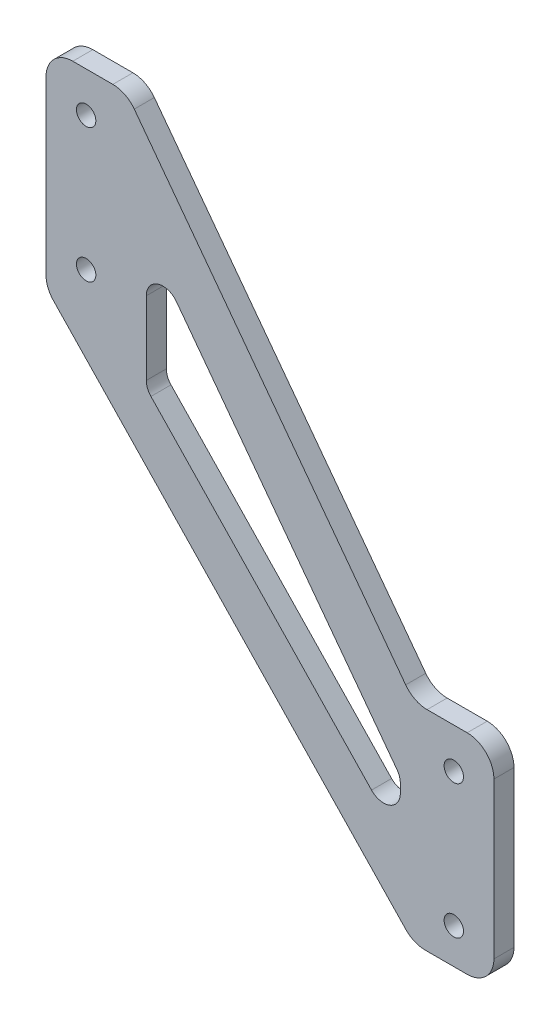
ISO-10303-21;
HEADER;
FILE_DESCRIPTION(('STEP AP214'),'2;1');
FILE_NAME('part.step','',(''),(''),'','','');
FILE_SCHEMA(('AUTOMOTIVE_DESIGN { 1 0 10303 214 1 1 1 1 }'));
ENDSEC;
DATA;
#1=APPLICATION_CONTEXT('core data for automotive mechanical design processes');
#2=APPLICATION_PROTOCOL_DEFINITION('international standard','automotive_design',2000,#1);
#3=PRODUCT_CONTEXT('',#1,'mechanical');
#4=PRODUCT('Part','Part','',(#3));
#5=PRODUCT_RELATED_PRODUCT_CATEGORY('part','',(#4));
#6=PRODUCT_DEFINITION_FORMATION('','',#4);
#7=PRODUCT_DEFINITION_CONTEXT('part definition',#1,'design');
#8=PRODUCT_DEFINITION('design','',#6,#7);
#9=PRODUCT_DEFINITION_SHAPE('','',#8);
#10=(LENGTH_UNIT() NAMED_UNIT(*) SI_UNIT(.MILLI.,.METRE.));
#11=(NAMED_UNIT(*) PLANE_ANGLE_UNIT() SI_UNIT($,.RADIAN.));
#12=(NAMED_UNIT(*) SI_UNIT($,.STERADIAN.) SOLID_ANGLE_UNIT());
#13=UNCERTAINTY_MEASURE_WITH_UNIT(LENGTH_MEASURE(1.E-05),#10,'distance_accuracy_value','');
#14=(GEOMETRIC_REPRESENTATION_CONTEXT(3) GLOBAL_UNCERTAINTY_ASSIGNED_CONTEXT((#13)) GLOBAL_UNIT_ASSIGNED_CONTEXT((#10,
#11,#12)) REPRESENTATION_CONTEXT('',''));
#15=CARTESIAN_POINT('',(0.,0.,0.));
#16=DIRECTION('',(0.,0.,1.));
#17=DIRECTION('',(1.,0.,0.));
#18=AXIS2_PLACEMENT_3D('',#15,#16,#17);
#19=CARTESIAN_POINT('',(0.,0.,3.));
#20=DIRECTION('',(0.,0.,1.));
#21=DIRECTION('',(1.,0.,0.));
#22=AXIS2_PLACEMENT_3D('',#19,#20,#21);
#23=PLANE('',#22);
#24=DIRECTION('',(-0.598885213021195,0.80083487787718,0.));
#25=VECTOR('',#24,1.);
#26=CARTESIAN_POINT('',(-8.,-4.68373388611148,3.));
#27=LINE('',#26,#25);
#28=CARTESIAN_POINT('',(-8.49791280530705,-4.01792025110787,3.));
#29=VERTEX_POINT('',#28);
#30=CARTESIAN_POINT('',(-41.4979128053071,40.1099867256363,3.));
#31=VERTEX_POINT('',#30);
#32=EDGE_CURVE('E346',#29,#31,#27,.T.);
#33=ORIENTED_EDGE('',*,*,#32,.F.);
#34=CARTESIAN_POINT('',(-10.5,-5.51513328366086,3.));
#35=DIRECTION('',(0.,0.,1.));
#36=DIRECTION('',(1.,0.,0.));
#37=AXIS2_PLACEMENT_3D('',#34,#35,#36);
#38=CIRCLE('',#37,2.5);
#39=CARTESIAN_POINT('',(-8.,-5.51513328366086,3.));
#40=VERTEX_POINT('',#39);
#41=EDGE_CURVE('E327',#29,#40,#38,.F.);
#42=ORIENTED_EDGE('',*,*,#41,.T.);
#43=DIRECTION('',(0.,1.,0.));
#44=VECTOR('',#43,1.);
#45=CARTESIAN_POINT('',(-8.,-13.0830754966218,3.));
#46=LINE('',#45,#44);
#47=CARTESIAN_POINT('',(-8.,-6.85265948234008,3.));
#48=VERTEX_POINT('',#47);
#49=EDGE_CURVE('E367',#48,#40,#46,.T.);
#50=ORIENTED_EDGE('',*,*,#49,.F.);
#51=CARTESIAN_POINT('',(-10.5,-6.85265948234008,3.));
#52=DIRECTION('',(0.,0.,1.));
#53=DIRECTION('',(1.,0.,0.));
#54=AXIS2_PLACEMENT_3D('',#51,#52,#53);
#55=CIRCLE('',#54,2.5);
#56=CARTESIAN_POINT('',(-12.3066046428692,-8.58071609725848,3.));
#57=VERTEX_POINT('',#56);
#58=EDGE_CURVE('E319',#48,#57,#55,.F.);
#59=ORIENTED_EDGE('',*,*,#58,.T.);
#60=DIRECTION('',(0.691222645967364,-0.722641857147699,0.));
#61=VECTOR('',#60,1.);
#62=CARTESIAN_POINT('',(-46.,26.644197230651,3.));
#63=LINE('',#62,#61);
#64=CARTESIAN_POINT('',(-45.3066046428693,25.9192839027415,3.));
#65=VERTEX_POINT('',#64);
#66=EDGE_CURVE('E337',#65,#57,#63,.T.);
#67=ORIENTED_EDGE('',*,*,#66,.F.);
#68=CARTESIAN_POINT('',(-43.5,27.6473405176599,3.));
#69=DIRECTION('',(0.,0.,1.));
#70=DIRECTION('',(1.,0.,0.));
#71=AXIS2_PLACEMENT_3D('',#68,#69,#70);
#72=CIRCLE('',#71,2.5);
#73=CARTESIAN_POINT('',(-46.,27.6473405176599,3.));
#74=VERTEX_POINT('',#73);
#75=EDGE_CURVE('E52',#65,#74,#72,.F.);
#76=ORIENTED_EDGE('',*,*,#75,.T.);
#77=DIRECTION('',(0.,-1.,0.));
#78=VECTOR('',#77,1.);
#79=CARTESIAN_POINT('',(-46.,46.1302196022606,3.));
#80=LINE('',#79,#78);
#81=CARTESIAN_POINT('',(-46.,38.6127736930833,3.));
#82=VERTEX_POINT('',#81);
#83=EDGE_CURVE('E335',#82,#74,#80,.T.);
#84=ORIENTED_EDGE('',*,*,#83,.F.);
#85=CARTESIAN_POINT('',(-43.5,38.6127736930833,3.));
#86=DIRECTION('',(0.,0.,1.));
#87=DIRECTION('',(1.,0.,0.));
#88=AXIS2_PLACEMENT_3D('',#85,#86,#87);
#89=CIRCLE('',#88,2.5);
#90=EDGE_CURVE('E323',#82,#31,#89,.F.);
#91=ORIENTED_EDGE('',*,*,#90,.T.);
#92=EDGE_LOOP('',(#33,#42,#50,#59,#67,#76,#84,#91));
#93=FACE_BOUND('',#92,.T.);
#94=CARTESIAN_POINT('',(-55.,37.5,3.));
#95=DIRECTION('',(0.,0.,1.));
#96=DIRECTION('',(1.,0.,0.));
#97=AXIS2_PLACEMENT_3D('',#94,#95,#96);
#98=CIRCLE('',#97,1.45);
#99=CARTESIAN_POINT('',(-53.55,37.5,3.));
#100=VERTEX_POINT('',#99);
#101=EDGE_CURVE('E376',#100,#100,#98,.T.);
#102=ORIENTED_EDGE('',*,*,#101,.F.);
#103=EDGE_LOOP('',(#102));
#104=FACE_BOUND('',#103,.T.);
#105=CARTESIAN_POINT('',(0.,0.,3.));
#106=DIRECTION('',(0.,0.,1.));
#107=DIRECTION('',(1.,0.,0.));
#108=AXIS2_PLACEMENT_3D('',#105,#106,#107);
#109=CIRCLE('',#108,1.45);
#110=CARTESIAN_POINT('',(1.45,0.,3.));
#111=VERTEX_POINT('',#110);
#112=EDGE_CURVE('E223',#111,#111,#109,.T.);
#113=ORIENTED_EDGE('',*,*,#112,.F.);
#114=EDGE_LOOP('',(#113));
#115=FACE_BOUND('',#114,.T.);
#116=DIRECTION('',(0.,1.,0.));
#117=VECTOR('',#116,1.);
#118=CARTESIAN_POINT('',(6.,-25.3009676093379,3.));
#119=LINE('',#118,#117);
#120=CARTESIAN_POINT('',(6.,-21.3009676093379,3.));
#121=VERTEX_POINT('',#120);
#122=CARTESIAN_POINT('',(6.,2.,3.));
#123=VERTEX_POINT('',#122);
#124=EDGE_CURVE('E401',#121,#123,#119,.T.);
#125=ORIENTED_EDGE('',*,*,#124,.T.);
#126=CARTESIAN_POINT('',(2.,2.,3.));
#127=DIRECTION('',(0.,0.,1.));
#128=DIRECTION('',(1.,0.,0.));
#129=AXIS2_PLACEMENT_3D('',#126,#127,#128);
#130=CIRCLE('',#129,4.);
#131=CARTESIAN_POINT('',(2.,6.,3.));
#132=VERTEX_POINT('',#131);
#133=EDGE_CURVE('E278',#123,#132,#130,.T.);
#134=ORIENTED_EDGE('',*,*,#133,.T.);
#135=DIRECTION('',(-1.,0.,0.));
#136=VECTOR('',#135,1.);
#137=CARTESIAN_POINT('',(6.,6.,3.));
#138=LINE('',#137,#136);
#139=CARTESIAN_POINT('',(-3.99651689475831,6.,3.));
#140=VERTEX_POINT('',#139);
#141=EDGE_CURVE('E232',#132,#140,#138,.T.);
#142=ORIENTED_EDGE('',*,*,#141,.T.);
#143=CARTESIAN_POINT('',(-3.99651689475831,10.,3.));
#144=DIRECTION('',(0.,0.,1.));
#145=DIRECTION('',(1.,0.,0.));
#146=AXIS2_PLACEMENT_3D('',#143,#144,#145);
#147=CIRCLE('',#146,4.);
#148=CARTESIAN_POINT('',(-7.19985640626703,7.60445914791522,3.));
#149=VERTEX_POINT('',#148);
#150=EDGE_CURVE('E204',#140,#149,#147,.F.);
#151=ORIENTED_EDGE('',*,*,#150,.T.);
#152=DIRECTION('',(-0.598885213021195,0.80083487787718,0.));
#153=VECTOR('',#152,1.);
#154=CARTESIAN_POINT('',(-6.,6.,3.));
#155=LINE('',#154,#153);
#156=CARTESIAN_POINT('',(-47.800143593733,61.8955408520847,3.));
#157=VERTEX_POINT('',#156);
#158=EDGE_CURVE('E214',#149,#157,#155,.T.);
#159=ORIENTED_EDGE('',*,*,#158,.T.);
#160=CARTESIAN_POINT('',(-51.0034831052417,59.5,3.));
#161=DIRECTION('',(0.,0.,1.));
#162=DIRECTION('',(1.,0.,0.));
#163=AXIS2_PLACEMENT_3D('',#160,#161,#162);
#164=CIRCLE('',#163,4.);
#165=CARTESIAN_POINT('',(-51.0034831052417,63.5,3.));
#166=VERTEX_POINT('',#165);
#167=EDGE_CURVE('E268',#157,#166,#164,.T.);
#168=ORIENTED_EDGE('',*,*,#167,.T.);
#169=DIRECTION('',(-1.,0.,0.));
#170=VECTOR('',#169,1.);
#171=CARTESIAN_POINT('',(-49.,63.5,3.));
#172=LINE('',#171,#170);
#173=CARTESIAN_POINT('',(-57.,63.5,3.));
#174=VERTEX_POINT('',#173);
#175=EDGE_CURVE('E390',#166,#174,#172,.T.);
#176=ORIENTED_EDGE('',*,*,#175,.T.);
#177=CARTESIAN_POINT('',(-57.,59.5,3.));
#178=DIRECTION('',(0.,0.,1.));
#179=DIRECTION('',(1.,0.,0.));
#180=AXIS2_PLACEMENT_3D('',#177,#178,#179);
#181=CIRCLE('',#180,4.);
#182=CARTESIAN_POINT('',(-61.,59.5,3.));
#183=VERTEX_POINT('',#182);
#184=EDGE_CURVE('E270',#174,#183,#181,.T.);
#185=ORIENTED_EDGE('',*,*,#184,.T.);
#186=DIRECTION('',(0.,-1.,0.));
#187=VECTOR('',#186,1.);
#188=CARTESIAN_POINT('',(-61.,63.5,3.));
#189=LINE('',#188,#187);
#190=CARTESIAN_POINT('',(-61.,33.8040616498765,3.));
#191=VERTEX_POINT('',#190);
#192=EDGE_CURVE('E393',#183,#191,#189,.T.);
#193=ORIENTED_EDGE('',*,*,#192,.T.);
#194=CARTESIAN_POINT('',(-57.,33.8040616498765,3.));
#195=DIRECTION('',(0.,0.,1.));
#196=DIRECTION('',(1.,0.,0.));
#197=AXIS2_PLACEMENT_3D('',#194,#195,#196);
#198=CIRCLE('',#197,4.);
#199=CARTESIAN_POINT('',(-59.8905674285908,31.0391710660071,3.));
#200=VERTEX_POINT('',#199);
#201=EDGE_CURVE('E272',#191,#200,#198,.T.);
#202=ORIENTED_EDGE('',*,*,#201,.T.);
#203=DIRECTION('',(0.691222645967364,-0.722641857147699,0.));
#204=VECTOR('',#203,1.);
#205=CARTESIAN_POINT('',(-61.,32.1990323906622,3.));
#206=LINE('',#205,#204);
#207=CARTESIAN_POINT('',(-7.18140900673357,-24.0658581932073,3.));
#208=VERTEX_POINT('',#207);
#209=EDGE_CURVE('E396',#200,#208,#206,.T.);
#210=ORIENTED_EDGE('',*,*,#209,.T.);
#211=CARTESIAN_POINT('',(-4.29084157814277,-21.3009676093379,3.));
#212=DIRECTION('',(0.,0.,1.));
#213=DIRECTION('',(1.,0.,0.));
#214=AXIS2_PLACEMENT_3D('',#211,#212,#213);
#215=CIRCLE('',#214,4.);
#216=CARTESIAN_POINT('',(-4.29084157814277,-25.3009676093379,3.));
#217=VERTEX_POINT('',#216);
#218=EDGE_CURVE('E274',#208,#217,#215,.T.);
#219=ORIENTED_EDGE('',*,*,#218,.T.);
#220=DIRECTION('',(1.,0.,0.));
#221=VECTOR('',#220,1.);
#222=CARTESIAN_POINT('',(-6.,-25.3009676093379,3.));
#223=LINE('',#222,#221);
#224=CARTESIAN_POINT('',(2.,-25.3009676093379,3.));
#225=VERTEX_POINT('',#224);
#226=EDGE_CURVE('E399',#217,#225,#223,.T.);
#227=ORIENTED_EDGE('',*,*,#226,.T.);
#228=CARTESIAN_POINT('',(2.,-21.3009676093379,3.));
#229=DIRECTION('',(0.,0.,1.));
#230=DIRECTION('',(1.,0.,0.));
#231=AXIS2_PLACEMENT_3D('',#228,#229,#230);
#232=CIRCLE('',#231,4.);
#233=EDGE_CURVE('E276',#225,#121,#232,.T.);
#234=ORIENTED_EDGE('',*,*,#233,.T.);
#235=EDGE_LOOP('',(#125,#134,#142,#151,#159,#168,#176,#185,#193,#202,#210,#219,#227,#234));
#236=FACE_BOUND('',#235,.T.);
#237=CARTESIAN_POINT('',(0.,-20.,3.));
#238=DIRECTION('',(0.,0.,1.));
#239=DIRECTION('',(1.,0.,0.));
#240=AXIS2_PLACEMENT_3D('',#237,#238,#239);
#241=CIRCLE('',#240,1.45);
#242=CARTESIAN_POINT('',(1.45,-20.,3.));
#243=VERTEX_POINT('',#242);
#244=EDGE_CURVE('E382',#243,#243,#241,.T.);
#245=ORIENTED_EDGE('',*,*,#244,.F.);
#246=EDGE_LOOP('',(#245));
#247=FACE_BOUND('',#246,.T.);
#248=CARTESIAN_POINT('',(-55.,57.5,3.));
#249=DIRECTION('',(0.,0.,1.));
#250=DIRECTION('',(1.,0.,0.));
#251=AXIS2_PLACEMENT_3D('',#248,#249,#250);
#252=CIRCLE('',#251,1.45);
#253=CARTESIAN_POINT('',(-53.55,57.5,3.));
#254=VERTEX_POINT('',#253);
#255=EDGE_CURVE('E370',#254,#254,#252,.T.);
#256=ORIENTED_EDGE('',*,*,#255,.F.);
#257=EDGE_LOOP('',(#256));
#258=FACE_BOUND('',#257,.T.);
#259=ADVANCED_FACE('F44',(#93,#104,#115,#236,#247,#258),#23,.T.);
#260=CARTESIAN_POINT('',(0.,0.,0.));
#261=DIRECTION('',(0.,0.,1.));
#262=DIRECTION('',(1.,0.,0.));
#263=AXIS2_PLACEMENT_3D('',#260,#261,#262);
#264=PLANE('',#263);
#265=DIRECTION('',(0.691222645967364,-0.722641857147699,0.));
#266=VECTOR('',#265,1.);
#267=CARTESIAN_POINT('',(-46.,26.644197230651,0.));
#268=LINE('',#267,#266);
#269=CARTESIAN_POINT('',(-45.3066046428693,25.9192839027415,0.));
#270=VERTEX_POINT('',#269);
#271=CARTESIAN_POINT('',(-12.3066046428692,-8.58071609725848,0.));
#272=VERTEX_POINT('',#271);
#273=EDGE_CURVE('E351',#270,#272,#268,.T.);
#274=ORIENTED_EDGE('',*,*,#273,.T.);
#275=CARTESIAN_POINT('',(-10.5,-6.85265948234008,0.));
#276=DIRECTION('',(0.,0.,1.));
#277=DIRECTION('',(1.,0.,0.));
#278=AXIS2_PLACEMENT_3D('',#275,#276,#277);
#279=CIRCLE('',#278,2.5);
#280=CARTESIAN_POINT('',(-8.,-6.85265948234008,0.));
#281=VERTEX_POINT('',#280);
#282=EDGE_CURVE('E321',#272,#281,#279,.T.);
#283=ORIENTED_EDGE('',*,*,#282,.T.);
#284=DIRECTION('',(0.,1.,0.));
#285=VECTOR('',#284,1.);
#286=CARTESIAN_POINT('',(-8.,-13.0830754966218,0.));
#287=LINE('',#286,#285);
#288=CARTESIAN_POINT('',(-8.,-5.51513328366086,0.));
#289=VERTEX_POINT('',#288);
#290=EDGE_CURVE('E357',#281,#289,#287,.T.);
#291=ORIENTED_EDGE('',*,*,#290,.T.);
#292=CARTESIAN_POINT('',(-10.5,-5.51513328366086,0.));
#293=DIRECTION('',(0.,0.,1.));
#294=DIRECTION('',(1.,0.,0.));
#295=AXIS2_PLACEMENT_3D('',#292,#293,#294);
#296=CIRCLE('',#295,2.5);
#297=CARTESIAN_POINT('',(-8.49791280530705,-4.01792025110787,0.));
#298=VERTEX_POINT('',#297);
#299=EDGE_CURVE('E66',#289,#298,#296,.T.);
#300=ORIENTED_EDGE('',*,*,#299,.T.);
#301=DIRECTION('',(-0.598885213021195,0.80083487787718,0.));
#302=VECTOR('',#301,1.);
#303=CARTESIAN_POINT('',(-8.,-4.68373388611148,0.));
#304=LINE('',#303,#302);
#305=CARTESIAN_POINT('',(-41.4979128053071,40.1099867256363,0.));
#306=VERTEX_POINT('',#305);
#307=EDGE_CURVE('E361',#298,#306,#304,.T.);
#308=ORIENTED_EDGE('',*,*,#307,.T.);
#309=CARTESIAN_POINT('',(-43.5,38.6127736930833,0.));
#310=DIRECTION('',(0.,0.,1.));
#311=DIRECTION('',(1.,0.,0.));
#312=AXIS2_PLACEMENT_3D('',#309,#310,#311);
#313=CIRCLE('',#312,2.5);
#314=CARTESIAN_POINT('',(-46.,38.6127736930833,0.));
#315=VERTEX_POINT('',#314);
#316=EDGE_CURVE('E325',#306,#315,#313,.T.);
#317=ORIENTED_EDGE('',*,*,#316,.T.);
#318=DIRECTION('',(0.,-1.,0.));
#319=VECTOR('',#318,1.);
#320=CARTESIAN_POINT('',(-46.,46.1302196022606,0.));
#321=LINE('',#320,#319);
#322=CARTESIAN_POINT('',(-46.,27.6473405176599,0.));
#323=VERTEX_POINT('',#322);
#324=EDGE_CURVE('E353',#315,#323,#321,.T.);
#325=ORIENTED_EDGE('',*,*,#324,.T.);
#326=CARTESIAN_POINT('',(-43.5,27.6473405176599,0.));
#327=DIRECTION('',(0.,0.,1.));
#328=DIRECTION('',(1.,0.,0.));
#329=AXIS2_PLACEMENT_3D('',#326,#327,#328);
#330=CIRCLE('',#329,2.5);
#331=EDGE_CURVE('E11',#323,#270,#330,.T.);
#332=ORIENTED_EDGE('',*,*,#331,.T.);
#333=EDGE_LOOP('',(#274,#283,#291,#300,#308,#317,#325,#332));
#334=FACE_BOUND('',#333,.T.);
#335=DIRECTION('',(-1.,0.,0.));
#336=VECTOR('',#335,1.);
#337=CARTESIAN_POINT('',(6.,6.,0.));
#338=LINE('',#337,#336);
#339=CARTESIAN_POINT('',(2.,6.,0.));
#340=VERTEX_POINT('',#339);
#341=CARTESIAN_POINT('',(-3.99651689475831,6.,0.));
#342=VERTEX_POINT('',#341);
#343=EDGE_CURVE('E246',#340,#342,#338,.T.);
#344=ORIENTED_EDGE('',*,*,#343,.F.);
#345=CARTESIAN_POINT('',(2.,2.,0.));
#346=DIRECTION('',(0.,0.,1.));
#347=DIRECTION('',(1.,0.,0.));
#348=AXIS2_PLACEMENT_3D('',#345,#346,#347);
#349=CIRCLE('',#348,4.);
#350=CARTESIAN_POINT('',(6.,2.,0.));
#351=VERTEX_POINT('',#350);
#352=EDGE_CURVE('E261',#340,#351,#349,.F.);
#353=ORIENTED_EDGE('',*,*,#352,.T.);
#354=DIRECTION('',(0.,1.,0.));
#355=VECTOR('',#354,1.);
#356=CARTESIAN_POINT('',(6.,-25.3009676093379,0.));
#357=LINE('',#356,#355);
#358=CARTESIAN_POINT('',(6.,-21.3009676093379,0.));
#359=VERTEX_POINT('',#358);
#360=EDGE_CURVE('E243',#359,#351,#357,.T.);
#361=ORIENTED_EDGE('',*,*,#360,.F.);
#362=CARTESIAN_POINT('',(2.,-21.3009676093379,0.));
#363=DIRECTION('',(0.,0.,1.));
#364=DIRECTION('',(1.,0.,0.));
#365=AXIS2_PLACEMENT_3D('',#362,#363,#364);
#366=CIRCLE('',#365,4.);
#367=CARTESIAN_POINT('',(2.,-25.3009676093379,0.));
#368=VERTEX_POINT('',#367);
#369=EDGE_CURVE('E259',#359,#368,#366,.F.);
#370=ORIENTED_EDGE('',*,*,#369,.T.);
#371=DIRECTION('',(1.,0.,0.));
#372=VECTOR('',#371,1.);
#373=CARTESIAN_POINT('',(-6.,-25.3009676093379,0.));
#374=LINE('',#373,#372);
#375=CARTESIAN_POINT('',(-4.29084157814277,-25.3009676093379,0.));
#376=VERTEX_POINT('',#375);
#377=EDGE_CURVE('E240',#376,#368,#374,.T.);
#378=ORIENTED_EDGE('',*,*,#377,.F.);
#379=CARTESIAN_POINT('',(-4.29084157814277,-21.3009676093379,0.));
#380=DIRECTION('',(0.,0.,1.));
#381=DIRECTION('',(1.,0.,0.));
#382=AXIS2_PLACEMENT_3D('',#379,#380,#381);
#383=CIRCLE('',#382,4.);
#384=CARTESIAN_POINT('',(-7.18140900673357,-24.0658581932073,0.));
#385=VERTEX_POINT('',#384);
#386=EDGE_CURVE('E257',#376,#385,#383,.F.);
#387=ORIENTED_EDGE('',*,*,#386,.T.);
#388=DIRECTION('',(0.691222645967364,-0.722641857147699,0.));
#389=VECTOR('',#388,1.);
#390=CARTESIAN_POINT('',(-61.,32.1990323906622,0.));
#391=LINE('',#390,#389);
#392=CARTESIAN_POINT('',(-59.8905674285908,31.0391710660071,0.));
#393=VERTEX_POINT('',#392);
#394=EDGE_CURVE('E237',#393,#385,#391,.T.);
#395=ORIENTED_EDGE('',*,*,#394,.F.);
#396=CARTESIAN_POINT('',(-57.,33.8040616498765,0.));
#397=DIRECTION('',(0.,0.,1.));
#398=DIRECTION('',(1.,0.,0.));
#399=AXIS2_PLACEMENT_3D('',#396,#397,#398);
#400=CIRCLE('',#399,4.);
#401=CARTESIAN_POINT('',(-61.,33.8040616498765,0.));
#402=VERTEX_POINT('',#401);
#403=EDGE_CURVE('E255',#393,#402,#400,.F.);
#404=ORIENTED_EDGE('',*,*,#403,.T.);
#405=DIRECTION('',(0.,-1.,0.));
#406=VECTOR('',#405,1.);
#407=CARTESIAN_POINT('',(-61.,63.5,0.));
#408=LINE('',#407,#406);
#409=CARTESIAN_POINT('',(-61.,59.5,0.));
#410=VERTEX_POINT('',#409);
#411=EDGE_CURVE('E226',#410,#402,#408,.T.);
#412=ORIENTED_EDGE('',*,*,#411,.F.);
#413=CARTESIAN_POINT('',(-57.,59.5,0.));
#414=DIRECTION('',(0.,0.,1.));
#415=DIRECTION('',(1.,0.,0.));
#416=AXIS2_PLACEMENT_3D('',#413,#414,#415);
#417=CIRCLE('',#416,4.);
#418=CARTESIAN_POINT('',(-57.,63.5,0.));
#419=VERTEX_POINT('',#418);
#420=EDGE_CURVE('E253',#410,#419,#417,.F.);
#421=ORIENTED_EDGE('',*,*,#420,.T.);
#422=DIRECTION('',(-1.,0.,0.));
#423=VECTOR('',#422,1.);
#424=CARTESIAN_POINT('',(-49.,63.5,0.));
#425=LINE('',#424,#423);
#426=CARTESIAN_POINT('',(-51.0034831052417,63.5,0.));
#427=VERTEX_POINT('',#426);
#428=EDGE_CURVE('E222',#427,#419,#425,.T.);
#429=ORIENTED_EDGE('',*,*,#428,.F.);
#430=CARTESIAN_POINT('',(-51.0034831052417,59.5,0.));
#431=DIRECTION('',(0.,0.,1.));
#432=DIRECTION('',(1.,0.,0.));
#433=AXIS2_PLACEMENT_3D('',#430,#431,#432);
#434=CIRCLE('',#433,4.);
#435=CARTESIAN_POINT('',(-47.800143593733,61.8955408520847,0.));
#436=VERTEX_POINT('',#435);
#437=EDGE_CURVE('E221',#427,#436,#434,.F.);
#438=ORIENTED_EDGE('',*,*,#437,.T.);
#439=DIRECTION('',(-0.598885213021195,0.80083487787718,0.));
#440=VECTOR('',#439,1.);
#441=CARTESIAN_POINT('',(-6.,6.,0.));
#442=LINE('',#441,#440);
#443=CARTESIAN_POINT('',(-7.19985640626703,7.60445914791522,0.));
#444=VERTEX_POINT('',#443);
#445=EDGE_CURVE('E211',#444,#436,#442,.T.);
#446=ORIENTED_EDGE('',*,*,#445,.F.);
#447=CARTESIAN_POINT('',(-3.99651689475831,10.,0.));
#448=DIRECTION('',(0.,0.,1.));
#449=DIRECTION('',(1.,0.,0.));
#450=AXIS2_PLACEMENT_3D('',#447,#448,#449);
#451=CIRCLE('',#450,4.);
#452=EDGE_CURVE('E194',#444,#342,#451,.T.);
#453=ORIENTED_EDGE('',*,*,#452,.T.);
#454=EDGE_LOOP('',(#344,#353,#361,#370,#378,#387,#395,#404,#412,#421,#429,#438,#446,#453));
#455=FACE_BOUND('',#454,.T.);
#456=CARTESIAN_POINT('',(0.,0.,0.));
#457=DIRECTION('',(0.,0.,1.));
#458=DIRECTION('',(1.,0.,0.));
#459=AXIS2_PLACEMENT_3D('',#456,#457,#458);
#460=CIRCLE('',#459,1.45);
#461=CARTESIAN_POINT('',(1.45,0.,0.));
#462=VERTEX_POINT('',#461);
#463=EDGE_CURVE('E229',#462,#462,#460,.T.);
#464=ORIENTED_EDGE('',*,*,#463,.T.);
#465=EDGE_LOOP('',(#464));
#466=FACE_BOUND('',#465,.T.);
#467=CARTESIAN_POINT('',(0.,-20.,0.));
#468=DIRECTION('',(0.,0.,1.));
#469=DIRECTION('',(1.,0.,0.));
#470=AXIS2_PLACEMENT_3D('',#467,#468,#469);
#471=CIRCLE('',#470,1.45);
#472=CARTESIAN_POINT('',(1.45,-20.,0.));
#473=VERTEX_POINT('',#472);
#474=EDGE_CURVE('E379',#473,#473,#471,.T.);
#475=ORIENTED_EDGE('',*,*,#474,.T.);
#476=EDGE_LOOP('',(#475));
#477=FACE_BOUND('',#476,.T.);
#478=CARTESIAN_POINT('',(-55.,37.5,0.));
#479=DIRECTION('',(0.,0.,1.));
#480=DIRECTION('',(1.,0.,0.));
#481=AXIS2_PLACEMENT_3D('',#478,#479,#480);
#482=CIRCLE('',#481,1.45);
#483=CARTESIAN_POINT('',(-53.55,37.5,0.));
#484=VERTEX_POINT('',#483);
#485=EDGE_CURVE('E373',#484,#484,#482,.T.);
#486=ORIENTED_EDGE('',*,*,#485,.T.);
#487=EDGE_LOOP('',(#486));
#488=FACE_BOUND('',#487,.T.);
#489=CARTESIAN_POINT('',(-55.,57.5,0.));
#490=DIRECTION('',(0.,0.,1.));
#491=DIRECTION('',(1.,0.,0.));
#492=AXIS2_PLACEMENT_3D('',#489,#490,#491);
#493=CIRCLE('',#492,1.45);
#494=CARTESIAN_POINT('',(-53.55,57.5,0.));
#495=VERTEX_POINT('',#494);
#496=EDGE_CURVE('E359',#495,#495,#493,.T.);
#497=ORIENTED_EDGE('',*,*,#496,.T.);
#498=EDGE_LOOP('',(#497));
#499=FACE_BOUND('',#498,.T.);
#500=ADVANCED_FACE('F218',(#334,#455,#466,#477,#488,#499),#264,.F.);
#501=CARTESIAN_POINT('',(-6.,6.,3.));
#502=DIRECTION('',(-0.80083487787718,-0.598885213021196,0.));
#503=DIRECTION('',(0.598885213021196,-0.80083487787718,0.));
#504=AXIS2_PLACEMENT_3D('',#501,#502,#503);
#505=PLANE('',#504);
#506=ORIENTED_EDGE('',*,*,#158,.F.);
#507=DIRECTION('',(0.,0.,-1.));
#508=VECTOR('',#507,1.);
#509=CARTESIAN_POINT('',(-7.19985640626703,7.60445914791522,0.));
#510=LINE('',#509,#508);
#511=EDGE_CURVE('E198',#149,#444,#510,.T.);
#512=ORIENTED_EDGE('',*,*,#511,.T.);
#513=ORIENTED_EDGE('',*,*,#445,.T.);
#514=DIRECTION('',(0.,0.,-1.));
#515=VECTOR('',#514,1.);
#516=CARTESIAN_POINT('',(-47.800143593733,61.8955408520848,3.));
#517=LINE('',#516,#515);
#518=EDGE_CURVE('E216',#436,#157,#517,.F.);
#519=ORIENTED_EDGE('',*,*,#518,.T.);
#520=EDGE_LOOP('',(#506,#512,#513,#519));
#521=FACE_BOUND('',#520,.T.);
#522=ADVANCED_FACE('F210',(#521),#505,.F.);
#523=CARTESIAN_POINT('',(-49.,63.5,3.));
#524=DIRECTION('',(0.,-1.,0.));
#525=DIRECTION('',(0.,0.,-1.));
#526=AXIS2_PLACEMENT_3D('',#523,#524,#525);
#527=PLANE('',#526);
#528=ORIENTED_EDGE('',*,*,#428,.T.);
#529=DIRECTION('',(0.,0.,-1.));
#530=VECTOR('',#529,1.);
#531=CARTESIAN_POINT('',(-57.,63.5,3.));
#532=LINE('',#531,#530);
#533=EDGE_CURVE('E205',#419,#174,#532,.F.);
#534=ORIENTED_EDGE('',*,*,#533,.T.);
#535=ORIENTED_EDGE('',*,*,#175,.F.);
#536=DIRECTION('',(0.,0.,-1.));
#537=VECTOR('',#536,1.);
#538=CARTESIAN_POINT('',(-51.0034831052417,63.5,3.));
#539=LINE('',#538,#537);
#540=EDGE_CURVE('E295',#166,#427,#539,.T.);
#541=ORIENTED_EDGE('',*,*,#540,.T.);
#542=EDGE_LOOP('',(#528,#534,#535,#541));
#543=FACE_BOUND('',#542,.T.);
#544=ADVANCED_FACE('F451',(#543),#527,.F.);
#545=CARTESIAN_POINT('',(-61.,63.5,3.));
#546=DIRECTION('',(1.,0.,0.));
#547=DIRECTION('',(0.,1.,0.));
#548=AXIS2_PLACEMENT_3D('',#545,#546,#547);
#549=PLANE('',#548);
#550=ORIENTED_EDGE('',*,*,#411,.T.);
#551=DIRECTION('',(0.,0.,-1.));
#552=VECTOR('',#551,1.);
#553=CARTESIAN_POINT('',(-61.,33.8040616498765,3.));
#554=LINE('',#553,#552);
#555=EDGE_CURVE('E293',#402,#191,#554,.F.);
#556=ORIENTED_EDGE('',*,*,#555,.T.);
#557=ORIENTED_EDGE('',*,*,#192,.F.);
#558=DIRECTION('',(0.,0.,-1.));
#559=VECTOR('',#558,1.);
#560=CARTESIAN_POINT('',(-61.,59.5,3.));
#561=LINE('',#560,#559);
#562=EDGE_CURVE('E290',#183,#410,#561,.T.);
#563=ORIENTED_EDGE('',*,*,#562,.T.);
#564=EDGE_LOOP('',(#550,#556,#557,#563));
#565=FACE_BOUND('',#564,.T.);
#566=ADVANCED_FACE('F443',(#565),#549,.F.);
#567=CARTESIAN_POINT('',(-61.,32.1990323906622,3.));
#568=DIRECTION('',(0.722641857147699,0.691222645967364,0.));
#569=DIRECTION('',(-0.691222645967364,0.722641857147699,0.));
#570=AXIS2_PLACEMENT_3D('',#567,#568,#569);
#571=PLANE('',#570);
#572=ORIENTED_EDGE('',*,*,#394,.T.);
#573=DIRECTION('',(0.,0.,-1.));
#574=VECTOR('',#573,1.);
#575=CARTESIAN_POINT('',(-7.18140900673357,-24.0658581932073,3.));
#576=LINE('',#575,#574);
#577=EDGE_CURVE('E288',#385,#208,#576,.F.);
#578=ORIENTED_EDGE('',*,*,#577,.T.);
#579=ORIENTED_EDGE('',*,*,#209,.F.);
#580=DIRECTION('',(0.,0.,-1.));
#581=VECTOR('',#580,1.);
#582=CARTESIAN_POINT('',(-59.8905674285908,31.0391710660071,3.));
#583=LINE('',#582,#581);
#584=EDGE_CURVE('E285',#200,#393,#583,.T.);
#585=ORIENTED_EDGE('',*,*,#584,.T.);
#586=EDGE_LOOP('',(#572,#578,#579,#585));
#587=FACE_BOUND('',#586,.T.);
#588=ADVANCED_FACE('F434',(#587),#571,.F.);
#589=CARTESIAN_POINT('',(-6.,-25.3009676093379,3.));
#590=DIRECTION('',(0.,1.,0.));
#591=DIRECTION('',(0.,0.,1.));
#592=AXIS2_PLACEMENT_3D('',#589,#590,#591);
#593=PLANE('',#592);
#594=ORIENTED_EDGE('',*,*,#377,.T.);
#595=DIRECTION('',(0.,0.,-1.));
#596=VECTOR('',#595,1.);
#597=CARTESIAN_POINT('',(2.,-25.3009676093379,3.));
#598=LINE('',#597,#596);
#599=EDGE_CURVE('E283',#368,#225,#598,.F.);
#600=ORIENTED_EDGE('',*,*,#599,.T.);
#601=ORIENTED_EDGE('',*,*,#226,.F.);
#602=DIRECTION('',(0.,0.,-1.));
#603=VECTOR('',#602,1.);
#604=CARTESIAN_POINT('',(-4.29084157814277,-25.3009676093379,3.));
#605=LINE('',#604,#603);
#606=EDGE_CURVE('E280',#217,#376,#605,.T.);
#607=ORIENTED_EDGE('',*,*,#606,.T.);
#608=EDGE_LOOP('',(#594,#600,#601,#607));
#609=FACE_BOUND('',#608,.T.);
#610=ADVANCED_FACE('F425',(#609),#593,.F.);
#611=CARTESIAN_POINT('',(6.,-25.3009676093379,3.));
#612=DIRECTION('',(-1.,0.,0.));
#613=DIRECTION('',(0.,-1.,0.));
#614=AXIS2_PLACEMENT_3D('',#611,#612,#613);
#615=PLANE('',#614);
#616=ORIENTED_EDGE('',*,*,#360,.T.);
#617=DIRECTION('',(0.,0.,-1.));
#618=VECTOR('',#617,1.);
#619=CARTESIAN_POINT('',(6.,2.,3.));
#620=LINE('',#619,#618);
#621=EDGE_CURVE('E266',#351,#123,#620,.F.);
#622=ORIENTED_EDGE('',*,*,#621,.T.);
#623=ORIENTED_EDGE('',*,*,#124,.F.);
#624=DIRECTION('',(0.,0.,-1.));
#625=VECTOR('',#624,1.);
#626=CARTESIAN_POINT('',(6.,-21.3009676093379,3.));
#627=LINE('',#626,#625);
#628=EDGE_CURVE('E263',#121,#359,#627,.T.);
#629=ORIENTED_EDGE('',*,*,#628,.T.);
#630=EDGE_LOOP('',(#616,#622,#623,#629));
#631=FACE_BOUND('',#630,.T.);
#632=ADVANCED_FACE('F417',(#631),#615,.F.);
#633=CARTESIAN_POINT('',(6.,6.,3.));
#634=DIRECTION('',(0.,-1.,0.));
#635=DIRECTION('',(1.,0.,0.));
#636=AXIS2_PLACEMENT_3D('',#633,#634,#635);
#637=PLANE('',#636);
#638=ORIENTED_EDGE('',*,*,#343,.T.);
#639=DIRECTION('',(0.,0.,-1.));
#640=VECTOR('',#639,1.);
#641=CARTESIAN_POINT('',(-3.99651689475831,6.,3.));
#642=LINE('',#641,#640);
#643=EDGE_CURVE('E199',#342,#140,#642,.F.);
#644=ORIENTED_EDGE('',*,*,#643,.T.);
#645=ORIENTED_EDGE('',*,*,#141,.F.);
#646=DIRECTION('',(0.,0.,-1.));
#647=VECTOR('',#646,1.);
#648=CARTESIAN_POINT('',(2.,6.,3.));
#649=LINE('',#648,#647);
#650=EDGE_CURVE('E215',#132,#340,#649,.T.);
#651=ORIENTED_EDGE('',*,*,#650,.T.);
#652=EDGE_LOOP('',(#638,#644,#645,#651));
#653=FACE_BOUND('',#652,.T.);
#654=ADVANCED_FACE('F411',(#653),#637,.F.);
#655=CARTESIAN_POINT('',(0.,0.,3.));
#656=DIRECTION('',(0.,0.,-1.));
#657=DIRECTION('',(-1.,0.,0.));
#658=AXIS2_PLACEMENT_3D('',#655,#656,#657);
#659=CYLINDRICAL_SURFACE('',#658,1.45);
#660=ORIENTED_EDGE('',*,*,#112,.T.);
#661=EDGE_LOOP('',(#660));
#662=FACE_BOUND('',#661,.T.);
#663=ORIENTED_EDGE('',*,*,#463,.F.);
#664=EDGE_LOOP('',(#663));
#665=FACE_BOUND('',#664,.T.);
#666=ADVANCED_FACE('F475',(#662,#665),#659,.F.);
#667=CARTESIAN_POINT('',(0.,-20.,3.));
#668=DIRECTION('',(0.,0.,-1.));
#669=DIRECTION('',(-1.,0.,0.));
#670=AXIS2_PLACEMENT_3D('',#667,#668,#669);
#671=CYLINDRICAL_SURFACE('',#670,1.45);
#672=ORIENTED_EDGE('',*,*,#244,.T.);
#673=EDGE_LOOP('',(#672));
#674=FACE_BOUND('',#673,.T.);
#675=ORIENTED_EDGE('',*,*,#474,.F.);
#676=EDGE_LOOP('',(#675));
#677=FACE_BOUND('',#676,.T.);
#678=ADVANCED_FACE('F575',(#674,#677),#671,.F.);
#679=CARTESIAN_POINT('',(-55.,37.5,3.));
#680=DIRECTION('',(0.,0.,-1.));
#681=DIRECTION('',(-1.,0.,0.));
#682=AXIS2_PLACEMENT_3D('',#679,#680,#681);
#683=CYLINDRICAL_SURFACE('',#682,1.45);
#684=ORIENTED_EDGE('',*,*,#101,.T.);
#685=EDGE_LOOP('',(#684));
#686=FACE_BOUND('',#685,.T.);
#687=ORIENTED_EDGE('',*,*,#485,.F.);
#688=EDGE_LOOP('',(#687));
#689=FACE_BOUND('',#688,.T.);
#690=ADVANCED_FACE('F572',(#686,#689),#683,.F.);
#691=CARTESIAN_POINT('',(-55.,57.5,3.));
#692=DIRECTION('',(0.,0.,-1.));
#693=DIRECTION('',(-1.,0.,0.));
#694=AXIS2_PLACEMENT_3D('',#691,#692,#693);
#695=CYLINDRICAL_SURFACE('',#694,1.45);
#696=ORIENTED_EDGE('',*,*,#255,.T.);
#697=EDGE_LOOP('',(#696));
#698=FACE_BOUND('',#697,.T.);
#699=ORIENTED_EDGE('',*,*,#496,.F.);
#700=EDGE_LOOP('',(#699));
#701=FACE_BOUND('',#700,.T.);
#702=ADVANCED_FACE('F566',(#698,#701),#695,.F.);
#703=CARTESIAN_POINT('',(-8.,-4.68373388611148,0.));
#704=DIRECTION('',(0.80083487787718,0.598885213021195,0.));
#705=DIRECTION('',(-0.598885213021195,0.80083487787718,0.));
#706=AXIS2_PLACEMENT_3D('',#703,#704,#705);
#707=PLANE('',#706);
#708=ORIENTED_EDGE('',*,*,#32,.T.);
#709=DIRECTION('',(0.,0.,1.));
#710=VECTOR('',#709,1.);
#711=CARTESIAN_POINT('',(-41.4979128053071,40.1099867256363,0.));
#712=LINE('',#711,#710);
#713=EDGE_CURVE('E59',#31,#306,#712,.F.);
#714=ORIENTED_EDGE('',*,*,#713,.T.);
#715=ORIENTED_EDGE('',*,*,#307,.F.);
#716=DIRECTION('',(0.,0.,1.));
#717=VECTOR('',#716,1.);
#718=CARTESIAN_POINT('',(-8.49791280530705,-4.01792025110787,3.));
#719=LINE('',#718,#717);
#720=EDGE_CURVE('E315',#298,#29,#719,.T.);
#721=ORIENTED_EDGE('',*,*,#720,.T.);
#722=EDGE_LOOP('',(#708,#714,#715,#721));
#723=FACE_BOUND('',#722,.T.);
#724=ADVANCED_FACE('F552',(#723),#707,.F.);
#725=CARTESIAN_POINT('',(-8.,-13.0830754966218,0.));
#726=DIRECTION('',(1.,0.,0.));
#727=DIRECTION('',(0.,1.,0.));
#728=AXIS2_PLACEMENT_3D('',#725,#726,#727);
#729=PLANE('',#728);
#730=ORIENTED_EDGE('',*,*,#290,.F.);
#731=DIRECTION('',(0.,0.,1.));
#732=VECTOR('',#731,1.);
#733=CARTESIAN_POINT('',(-8.,-6.85265948234008,3.));
#734=LINE('',#733,#732);
#735=EDGE_CURVE('E302',#281,#48,#734,.T.);
#736=ORIENTED_EDGE('',*,*,#735,.T.);
#737=ORIENTED_EDGE('',*,*,#49,.T.);
#738=DIRECTION('',(0.,0.,1.));
#739=VECTOR('',#738,1.);
#740=CARTESIAN_POINT('',(-8.,-5.51513328366086,0.));
#741=LINE('',#740,#739);
#742=EDGE_CURVE('E300',#40,#289,#741,.F.);
#743=ORIENTED_EDGE('',*,*,#742,.T.);
#744=EDGE_LOOP('',(#730,#736,#737,#743));
#745=FACE_BOUND('',#744,.T.);
#746=ADVANCED_FACE('F557',(#745),#729,.F.);
#747=CARTESIAN_POINT('',(-46.,26.644197230651,0.));
#748=DIRECTION('',(-0.722641857147699,-0.691222645967364,0.));
#749=DIRECTION('',(0.691222645967364,-0.722641857147699,0.));
#750=AXIS2_PLACEMENT_3D('',#747,#748,#749);
#751=PLANE('',#750);
#752=ORIENTED_EDGE('',*,*,#66,.T.);
#753=DIRECTION('',(0.,0.,1.));
#754=VECTOR('',#753,1.);
#755=CARTESIAN_POINT('',(-12.3066046428692,-8.58071609725849,0.));
#756=LINE('',#755,#754);
#757=EDGE_CURVE('E308',#57,#272,#756,.F.);
#758=ORIENTED_EDGE('',*,*,#757,.T.);
#759=ORIENTED_EDGE('',*,*,#273,.F.);
#760=DIRECTION('',(0.,0.,1.));
#761=VECTOR('',#760,1.);
#762=CARTESIAN_POINT('',(-45.3066046428693,25.9192839027415,3.));
#763=LINE('',#762,#761);
#764=EDGE_CURVE('E305',#270,#65,#763,.T.);
#765=ORIENTED_EDGE('',*,*,#764,.T.);
#766=EDGE_LOOP('',(#752,#758,#759,#765));
#767=FACE_BOUND('',#766,.T.);
#768=ADVANCED_FACE('F355',(#767),#751,.F.);
#769=CARTESIAN_POINT('',(-46.,46.1302196022606,0.));
#770=DIRECTION('',(-1.,0.,0.));
#771=DIRECTION('',(0.,0.,1.));
#772=AXIS2_PLACEMENT_3D('',#769,#770,#771);
#773=PLANE('',#772);
#774=ORIENTED_EDGE('',*,*,#324,.F.);
#775=DIRECTION('',(0.,0.,1.));
#776=VECTOR('',#775,1.);
#777=CARTESIAN_POINT('',(-46.,38.6127736930833,3.));
#778=LINE('',#777,#776);
#779=EDGE_CURVE('E312',#315,#82,#778,.T.);
#780=ORIENTED_EDGE('',*,*,#779,.T.);
#781=ORIENTED_EDGE('',*,*,#83,.T.);
#782=DIRECTION('',(0.,0.,1.));
#783=VECTOR('',#782,1.);
#784=CARTESIAN_POINT('',(-46.,27.6473405176599,0.));
#785=LINE('',#784,#783);
#786=EDGE_CURVE('E310',#74,#323,#785,.F.);
#787=ORIENTED_EDGE('',*,*,#786,.T.);
#788=EDGE_LOOP('',(#774,#780,#781,#787));
#789=FACE_BOUND('',#788,.T.);
#790=ADVANCED_FACE('F343',(#789),#773,.F.);
#791=CARTESIAN_POINT('',(-3.99651689475831,10.,3.));
#792=DIRECTION('',(0.,0.,1.));
#793=DIRECTION('',(1.,0.,0.));
#794=AXIS2_PLACEMENT_3D('',#791,#792,#793);
#795=CYLINDRICAL_SURFACE('',#794,4.);
#796=ORIENTED_EDGE('',*,*,#150,.F.);
#797=ORIENTED_EDGE('',*,*,#643,.F.);
#798=ORIENTED_EDGE('',*,*,#452,.F.);
#799=ORIENTED_EDGE('',*,*,#511,.F.);
#800=EDGE_LOOP('',(#796,#797,#798,#799));
#801=FACE_BOUND('',#800,.T.);
#802=ADVANCED_FACE('F197',(#801),#795,.F.);
#803=CARTESIAN_POINT('',(2.,2.,3.));
#804=DIRECTION('',(0.,0.,-1.));
#805=DIRECTION('',(-1.,0.,0.));
#806=AXIS2_PLACEMENT_3D('',#803,#804,#805);
#807=CYLINDRICAL_SURFACE('',#806,4.);
#808=ORIENTED_EDGE('',*,*,#133,.F.);
#809=ORIENTED_EDGE('',*,*,#621,.F.);
#810=ORIENTED_EDGE('',*,*,#352,.F.);
#811=ORIENTED_EDGE('',*,*,#650,.F.);
#812=EDGE_LOOP('',(#808,#809,#810,#811));
#813=FACE_BOUND('',#812,.T.);
#814=ADVANCED_FACE('F413',(#813),#807,.T.);
#815=CARTESIAN_POINT('',(2.,-21.3009676093379,3.));
#816=DIRECTION('',(0.,0.,-1.));
#817=DIRECTION('',(-1.,0.,0.));
#818=AXIS2_PLACEMENT_3D('',#815,#816,#817);
#819=CYLINDRICAL_SURFACE('',#818,4.);
#820=ORIENTED_EDGE('',*,*,#233,.F.);
#821=ORIENTED_EDGE('',*,*,#599,.F.);
#822=ORIENTED_EDGE('',*,*,#369,.F.);
#823=ORIENTED_EDGE('',*,*,#628,.F.);
#824=EDGE_LOOP('',(#820,#821,#822,#823));
#825=FACE_BOUND('',#824,.T.);
#826=ADVANCED_FACE('F421',(#825),#819,.T.);
#827=CARTESIAN_POINT('',(-4.29084157814277,-21.3009676093379,3.));
#828=DIRECTION('',(0.,0.,-1.));
#829=DIRECTION('',(-1.,0.,0.));
#830=AXIS2_PLACEMENT_3D('',#827,#828,#829);
#831=CYLINDRICAL_SURFACE('',#830,4.);
#832=ORIENTED_EDGE('',*,*,#218,.F.);
#833=ORIENTED_EDGE('',*,*,#577,.F.);
#834=ORIENTED_EDGE('',*,*,#386,.F.);
#835=ORIENTED_EDGE('',*,*,#606,.F.);
#836=EDGE_LOOP('',(#832,#833,#834,#835));
#837=FACE_BOUND('',#836,.T.);
#838=ADVANCED_FACE('F430',(#837),#831,.T.);
#839=CARTESIAN_POINT('',(-57.,33.8040616498765,3.));
#840=DIRECTION('',(0.,0.,-1.));
#841=DIRECTION('',(-1.,0.,0.));
#842=AXIS2_PLACEMENT_3D('',#839,#840,#841);
#843=CYLINDRICAL_SURFACE('',#842,4.);
#844=ORIENTED_EDGE('',*,*,#201,.F.);
#845=ORIENTED_EDGE('',*,*,#555,.F.);
#846=ORIENTED_EDGE('',*,*,#403,.F.);
#847=ORIENTED_EDGE('',*,*,#584,.F.);
#848=EDGE_LOOP('',(#844,#845,#846,#847));
#849=FACE_BOUND('',#848,.T.);
#850=ADVANCED_FACE('F439',(#849),#843,.T.);
#851=CARTESIAN_POINT('',(-57.,59.5,3.));
#852=DIRECTION('',(0.,0.,-1.));
#853=DIRECTION('',(-1.,0.,0.));
#854=AXIS2_PLACEMENT_3D('',#851,#852,#853);
#855=CYLINDRICAL_SURFACE('',#854,4.);
#856=ORIENTED_EDGE('',*,*,#184,.F.);
#857=ORIENTED_EDGE('',*,*,#533,.F.);
#858=ORIENTED_EDGE('',*,*,#420,.F.);
#859=ORIENTED_EDGE('',*,*,#562,.F.);
#860=EDGE_LOOP('',(#856,#857,#858,#859));
#861=FACE_BOUND('',#860,.T.);
#862=ADVANCED_FACE('F448',(#861),#855,.T.);
#863=CARTESIAN_POINT('',(-51.0034831052417,59.5,3.));
#864=DIRECTION('',(0.,0.,-1.));
#865=DIRECTION('',(-1.,0.,0.));
#866=AXIS2_PLACEMENT_3D('',#863,#864,#865);
#867=CYLINDRICAL_SURFACE('',#866,4.);
#868=ORIENTED_EDGE('',*,*,#167,.F.);
#869=ORIENTED_EDGE('',*,*,#518,.F.);
#870=ORIENTED_EDGE('',*,*,#437,.F.);
#871=ORIENTED_EDGE('',*,*,#540,.F.);
#872=EDGE_LOOP('',(#868,#869,#870,#871));
#873=FACE_BOUND('',#872,.T.);
#874=ADVANCED_FACE('F456',(#873),#867,.T.);
#875=CARTESIAN_POINT('',(-10.5,-6.85265948234008,0.));
#876=DIRECTION('',(0.,0.,-1.));
#877=DIRECTION('',(-1.,0.,0.));
#878=AXIS2_PLACEMENT_3D('',#875,#876,#877);
#879=CYLINDRICAL_SURFACE('',#878,2.5);
#880=ORIENTED_EDGE('',*,*,#282,.F.);
#881=ORIENTED_EDGE('',*,*,#757,.F.);
#882=ORIENTED_EDGE('',*,*,#58,.F.);
#883=ORIENTED_EDGE('',*,*,#735,.F.);
#884=EDGE_LOOP('',(#880,#881,#882,#883));
#885=FACE_BOUND('',#884,.T.);
#886=ADVANCED_FACE('F458',(#885),#879,.F.);
#887=CARTESIAN_POINT('',(-43.5,38.6127736930833,0.));
#888=DIRECTION('',(0.,0.,-1.));
#889=DIRECTION('',(-1.,0.,0.));
#890=AXIS2_PLACEMENT_3D('',#887,#888,#889);
#891=CYLINDRICAL_SURFACE('',#890,2.5);
#892=ORIENTED_EDGE('',*,*,#316,.F.);
#893=ORIENTED_EDGE('',*,*,#713,.F.);
#894=ORIENTED_EDGE('',*,*,#90,.F.);
#895=ORIENTED_EDGE('',*,*,#779,.F.);
#896=EDGE_LOOP('',(#892,#893,#894,#895));
#897=FACE_BOUND('',#896,.T.);
#898=ADVANCED_FACE('F465',(#897),#891,.F.);
#899=CARTESIAN_POINT('',(-10.5,-5.51513328366086,0.));
#900=DIRECTION('',(0.,0.,-1.));
#901=DIRECTION('',(-1.,0.,0.));
#902=AXIS2_PLACEMENT_3D('',#899,#900,#901);
#903=CYLINDRICAL_SURFACE('',#902,2.5);
#904=ORIENTED_EDGE('',*,*,#299,.F.);
#905=ORIENTED_EDGE('',*,*,#742,.F.);
#906=ORIENTED_EDGE('',*,*,#41,.F.);
#907=ORIENTED_EDGE('',*,*,#720,.F.);
#908=EDGE_LOOP('',(#904,#905,#906,#907));
#909=FACE_BOUND('',#908,.T.);
#910=ADVANCED_FACE('F531',(#909),#903,.F.);
#911=CARTESIAN_POINT('',(-43.5,27.6473405176599,0.));
#912=DIRECTION('',(0.,0.,-1.));
#913=DIRECTION('',(-1.,0.,0.));
#914=AXIS2_PLACEMENT_3D('',#911,#912,#913);
#915=CYLINDRICAL_SURFACE('',#914,2.5);
#916=ORIENTED_EDGE('',*,*,#331,.F.);
#917=ORIENTED_EDGE('',*,*,#786,.F.);
#918=ORIENTED_EDGE('',*,*,#75,.F.);
#919=ORIENTED_EDGE('',*,*,#764,.F.);
#920=EDGE_LOOP('',(#916,#917,#918,#919));
#921=FACE_BOUND('',#920,.T.);
#922=ADVANCED_FACE('F46',(#921),#915,.F.);
#923=CLOSED_SHELL('',(#259,#500,#522,#544,#566,#588,#610,#632,#654,#666,#678,#690,#702,#724,
#746,#768,#790,#802,#814,#826,#838,#850,#862,#874,#886,#898,#910,#922));
#924=MANIFOLD_SOLID_BREP('B2',#923);
#925=ADVANCED_BREP_SHAPE_REPRESENTATION('',(#18,#924),#14);
#926=SHAPE_DEFINITION_REPRESENTATION(#9,#925);
ENDSEC;
END-ISO-10303-21;
